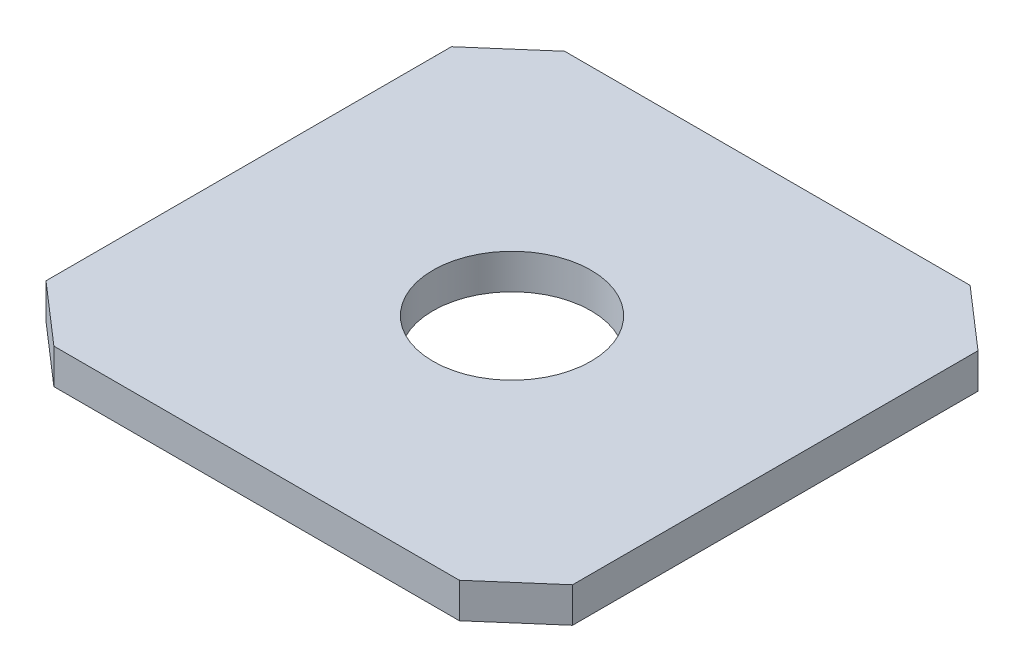
ISO-10303-21;
HEADER;
FILE_DESCRIPTION(('STEP AP214'),'2;1');
FILE_NAME('part.step','',(''),(''),'','','');
FILE_SCHEMA(('AUTOMOTIVE_DESIGN { 1 0 10303 214 1 1 1 1 }'));
ENDSEC;
DATA;
#1=APPLICATION_CONTEXT('core data for automotive mechanical design processes');
#2=APPLICATION_PROTOCOL_DEFINITION('international standard','automotive_design',2000,#1);
#3=PRODUCT_CONTEXT('',#1,'mechanical');
#4=PRODUCT('Part','Part','',(#3));
#5=PRODUCT_RELATED_PRODUCT_CATEGORY('part','',(#4));
#6=PRODUCT_DEFINITION_FORMATION('','',#4);
#7=PRODUCT_DEFINITION_CONTEXT('part definition',#1,'design');
#8=PRODUCT_DEFINITION('design','',#6,#7);
#9=PRODUCT_DEFINITION_SHAPE('','',#8);
#10=(LENGTH_UNIT() NAMED_UNIT(*) SI_UNIT(.MILLI.,.METRE.));
#11=(NAMED_UNIT(*) PLANE_ANGLE_UNIT() SI_UNIT($,.RADIAN.));
#12=(NAMED_UNIT(*) SI_UNIT($,.STERADIAN.) SOLID_ANGLE_UNIT());
#13=UNCERTAINTY_MEASURE_WITH_UNIT(LENGTH_MEASURE(1.E-05),#10,'distance_accuracy_value','');
#14=(GEOMETRIC_REPRESENTATION_CONTEXT(3) GLOBAL_UNCERTAINTY_ASSIGNED_CONTEXT((#13)) GLOBAL_UNIT_ASSIGNED_CONTEXT((#10,
#11,#12)) REPRESENTATION_CONTEXT('',''));
#15=CARTESIAN_POINT('',(0.,0.,0.));
#16=DIRECTION('',(0.,0.,1.));
#17=DIRECTION('',(1.,0.,0.));
#18=AXIS2_PLACEMENT_3D('',#15,#16,#17);
#19=CARTESIAN_POINT('',(-6.6972861855531,2.,-22.7975658796558));
#20=DIRECTION('',(0.656178714924794,0.,0.754605522163498));
#21=DIRECTION('',(0.754605522163498,0.,-0.656178714924794));
#22=AXIS2_PLACEMENT_3D('',#19,#20,#21);
#23=PLANE('',#22);
#24=DIRECTION('',(-0.754605522163498,0.,0.656178714924794));
#25=VECTOR('',#24,1.);
#26=CARTESIAN_POINT('',(-6.6972861855531,0.,-22.7975658796558));
#27=LINE('',#26,#25);
#28=CARTESIAN_POINT('',(-6.6972861855531,0.,-22.7975658796558));
#29=VERTEX_POINT('',#28);
#30=CARTESIAN_POINT('',(-10.1472861855532,0.,-19.7975658796556));
#31=VERTEX_POINT('',#30);
#32=EDGE_CURVE('E139',#29,#31,#27,.T.);
#33=ORIENTED_EDGE('',*,*,#32,.T.);
#34=DIRECTION('',(0.,-1.,0.));
#35=VECTOR('',#34,1.);
#36=CARTESIAN_POINT('',(-10.1472861855532,2.,-19.7975658796556));
#37=LINE('',#36,#35);
#38=CARTESIAN_POINT('',(-10.1472861855532,2.,-19.7975658796556));
#39=VERTEX_POINT('',#38);
#40=EDGE_CURVE('E11',#39,#31,#37,.T.);
#41=ORIENTED_EDGE('',*,*,#40,.F.);
#42=DIRECTION('',(-0.754605522163498,0.,0.656178714924794));
#43=VECTOR('',#42,1.);
#44=CARTESIAN_POINT('',(-6.6972861855531,2.,-22.7975658796558));
#45=LINE('',#44,#43);
#46=CARTESIAN_POINT('',(-6.6972861855531,2.,-22.7975658796558));
#47=VERTEX_POINT('',#46);
#48=EDGE_CURVE('E154',#47,#39,#45,.T.);
#49=ORIENTED_EDGE('',*,*,#48,.F.);
#50=DIRECTION('',(0.,-1.,0.));
#51=VECTOR('',#50,1.);
#52=CARTESIAN_POINT('',(-6.6972861855531,2.,-22.7975658796558));
#53=LINE('',#52,#51);
#54=EDGE_CURVE('E135',#47,#29,#53,.T.);
#55=ORIENTED_EDGE('',*,*,#54,.T.);
#56=EDGE_LOOP('',(#33,#41,#49,#55));
#57=FACE_BOUND('',#56,.T.);
#58=ADVANCED_FACE('F43',(#57),#23,.F.);
#59=CARTESIAN_POINT('',(-10.1472861855532,2.,-19.7975658796556));
#60=DIRECTION('',(1.,0.,0.));
#61=DIRECTION('',(0.,0.,-1.));
#62=AXIS2_PLACEMENT_3D('',#59,#60,#61);
#63=PLANE('',#62);
#64=DIRECTION('',(0.,0.,1.));
#65=VECTOR('',#64,1.);
#66=CARTESIAN_POINT('',(-10.1472861855532,0.,-19.7975658796556));
#67=LINE('',#66,#65);
#68=CARTESIAN_POINT('',(-10.1472861855532,0.,3.30243412034426));
#69=VERTEX_POINT('',#68);
#70=EDGE_CURVE('E142',#31,#69,#67,.T.);
#71=ORIENTED_EDGE('',*,*,#70,.T.);
#72=DIRECTION('',(0.,-1.,0.));
#73=VECTOR('',#72,1.);
#74=CARTESIAN_POINT('',(-10.1472861855532,2.,3.30243412034426));
#75=LINE('',#74,#73);
#76=CARTESIAN_POINT('',(-10.1472861855532,2.,3.30243412034426));
#77=VERTEX_POINT('',#76);
#78=EDGE_CURVE('E51',#77,#69,#75,.T.);
#79=ORIENTED_EDGE('',*,*,#78,.F.);
#80=DIRECTION('',(0.,0.,1.));
#81=VECTOR('',#80,1.);
#82=CARTESIAN_POINT('',(-10.1472861855532,2.,-19.7975658796556));
#83=LINE('',#82,#81);
#84=EDGE_CURVE('E102',#39,#77,#83,.T.);
#85=ORIENTED_EDGE('',*,*,#84,.F.);
#86=ORIENTED_EDGE('',*,*,#40,.T.);
#87=EDGE_LOOP('',(#71,#79,#85,#86));
#88=FACE_BOUND('',#87,.T.);
#89=ADVANCED_FACE('F210',(#88),#63,.F.);
#90=CARTESIAN_POINT('',(-10.1472861855532,2.,3.30243412034426));
#91=DIRECTION('',(0.656178714924794,0.,-0.754605522163498));
#92=DIRECTION('',(-0.754605522163498,0.,-0.656178714924794));
#93=AXIS2_PLACEMENT_3D('',#90,#91,#92);
#94=PLANE('',#93);
#95=DIRECTION('',(0.754605522163498,0.,0.656178714924794));
#96=VECTOR('',#95,1.);
#97=CARTESIAN_POINT('',(-10.1472861855532,0.,3.30243412034426));
#98=LINE('',#97,#96);
#99=CARTESIAN_POINT('',(-6.6972861855531,0.,6.30243412034437));
#100=VERTEX_POINT('',#99);
#101=EDGE_CURVE('E145',#69,#100,#98,.T.);
#102=ORIENTED_EDGE('',*,*,#101,.T.);
#103=DIRECTION('',(0.,-1.,0.));
#104=VECTOR('',#103,1.);
#105=CARTESIAN_POINT('',(-6.6972861855531,2.,6.30243412034437));
#106=LINE('',#105,#104);
#107=CARTESIAN_POINT('',(-6.6972861855531,2.,6.30243412034437));
#108=VERTEX_POINT('',#107);
#109=EDGE_CURVE('E161',#108,#100,#106,.T.);
#110=ORIENTED_EDGE('',*,*,#109,.F.);
#111=DIRECTION('',(0.754605522163498,0.,0.656178714924794));
#112=VECTOR('',#111,1.);
#113=CARTESIAN_POINT('',(-10.1472861855532,2.,3.30243412034426));
#114=LINE('',#113,#112);
#115=EDGE_CURVE('E169',#77,#108,#114,.T.);
#116=ORIENTED_EDGE('',*,*,#115,.F.);
#117=ORIENTED_EDGE('',*,*,#78,.T.);
#118=EDGE_LOOP('',(#102,#110,#116,#117));
#119=FACE_BOUND('',#118,.T.);
#120=ADVANCED_FACE('F167',(#119),#94,.F.);
#121=CARTESIAN_POINT('',(-6.6972861855531,2.,6.30243412034437));
#122=DIRECTION('',(0.,0.,-1.));
#123=DIRECTION('',(-1.,0.,0.));
#124=AXIS2_PLACEMENT_3D('',#121,#122,#123);
#125=PLANE('',#124);
#126=DIRECTION('',(1.,0.,0.));
#127=VECTOR('',#126,1.);
#128=CARTESIAN_POINT('',(-6.6972861855531,0.,6.30243412034437));
#129=LINE('',#128,#127);
#130=CARTESIAN_POINT('',(16.4027138144468,0.,6.30243412034437));
#131=VERTEX_POINT('',#130);
#132=EDGE_CURVE('E147',#100,#131,#129,.T.);
#133=ORIENTED_EDGE('',*,*,#132,.T.);
#134=DIRECTION('',(0.,-1.,0.));
#135=VECTOR('',#134,1.);
#136=CARTESIAN_POINT('',(16.4027138144468,2.,6.30243412034437));
#137=LINE('',#136,#135);
#138=CARTESIAN_POINT('',(16.4027138144468,2.,6.30243412034437));
#139=VERTEX_POINT('',#138);
#140=EDGE_CURVE('E158',#139,#131,#137,.T.);
#141=ORIENTED_EDGE('',*,*,#140,.F.);
#142=DIRECTION('',(1.,0.,0.));
#143=VECTOR('',#142,1.);
#144=CARTESIAN_POINT('',(-6.6972861855531,2.,6.30243412034437));
#145=LINE('',#144,#143);
#146=EDGE_CURVE('E181',#108,#139,#145,.T.);
#147=ORIENTED_EDGE('',*,*,#146,.F.);
#148=ORIENTED_EDGE('',*,*,#109,.T.);
#149=EDGE_LOOP('',(#133,#141,#147,#148));
#150=FACE_BOUND('',#149,.T.);
#151=ADVANCED_FACE('F177',(#150),#125,.F.);
#152=CARTESIAN_POINT('',(16.4027138144468,2.,6.30243412034437));
#153=DIRECTION('',(-0.656178714924794,0.,-0.754605522163498));
#154=DIRECTION('',(-0.754605522163498,0.,0.656178714924794));
#155=AXIS2_PLACEMENT_3D('',#152,#153,#154);
#156=PLANE('',#155);
#157=DIRECTION('',(0.754605522163498,0.,-0.656178714924794));
#158=VECTOR('',#157,1.);
#159=CARTESIAN_POINT('',(16.4027138144468,0.,6.30243412034437));
#160=LINE('',#159,#158);
#161=CARTESIAN_POINT('',(19.8527138144469,0.,3.30243412034426));
#162=VERTEX_POINT('',#161);
#163=EDGE_CURVE('E149',#131,#162,#160,.T.);
#164=ORIENTED_EDGE('',*,*,#163,.T.);
#165=DIRECTION('',(0.,-1.,0.));
#166=VECTOR('',#165,1.);
#167=CARTESIAN_POINT('',(19.8527138144469,2.,3.30243412034426));
#168=LINE('',#167,#166);
#169=CARTESIAN_POINT('',(19.8527138144469,2.,3.30243412034426));
#170=VERTEX_POINT('',#169);
#171=EDGE_CURVE('E130',#170,#162,#168,.T.);
#172=ORIENTED_EDGE('',*,*,#171,.F.);
#173=DIRECTION('',(0.754605522163498,0.,-0.656178714924794));
#174=VECTOR('',#173,1.);
#175=CARTESIAN_POINT('',(16.4027138144468,2.,6.30243412034437));
#176=LINE('',#175,#174);
#177=EDGE_CURVE('E121',#139,#170,#176,.T.);
#178=ORIENTED_EDGE('',*,*,#177,.F.);
#179=ORIENTED_EDGE('',*,*,#140,.T.);
#180=EDGE_LOOP('',(#164,#172,#178,#179));
#181=FACE_BOUND('',#180,.T.);
#182=ADVANCED_FACE('F180',(#181),#156,.F.);
#183=CARTESIAN_POINT('',(19.8527138144469,2.,3.30243412034426));
#184=DIRECTION('',(-1.,0.,0.));
#185=DIRECTION('',(0.,0.,1.));
#186=AXIS2_PLACEMENT_3D('',#183,#184,#185);
#187=PLANE('',#186);
#188=DIRECTION('',(0.,0.,-1.));
#189=VECTOR('',#188,1.);
#190=CARTESIAN_POINT('',(19.8527138144469,0.,3.30243412034426));
#191=LINE('',#190,#189);
#192=CARTESIAN_POINT('',(19.8527138144469,0.,-19.7975658796556));
#193=VERTEX_POINT('',#192);
#194=EDGE_CURVE('E129',#162,#193,#191,.T.);
#195=ORIENTED_EDGE('',*,*,#194,.T.);
#196=DIRECTION('',(0.,-1.,0.));
#197=VECTOR('',#196,1.);
#198=CARTESIAN_POINT('',(19.8527138144469,2.,-19.7975658796556));
#199=LINE('',#198,#197);
#200=CARTESIAN_POINT('',(19.8527138144469,2.,-19.7975658796556));
#201=VERTEX_POINT('',#200);
#202=EDGE_CURVE('E126',#201,#193,#199,.T.);
#203=ORIENTED_EDGE('',*,*,#202,.F.);
#204=DIRECTION('',(0.,0.,-1.));
#205=VECTOR('',#204,1.);
#206=CARTESIAN_POINT('',(19.8527138144469,2.,3.30243412034426));
#207=LINE('',#206,#205);
#208=EDGE_CURVE('E115',#170,#201,#207,.T.);
#209=ORIENTED_EDGE('',*,*,#208,.F.);
#210=ORIENTED_EDGE('',*,*,#171,.T.);
#211=EDGE_LOOP('',(#195,#203,#209,#210));
#212=FACE_BOUND('',#211,.T.);
#213=ADVANCED_FACE('F127',(#212),#187,.F.);
#214=CARTESIAN_POINT('',(19.8527138144469,2.,-19.7975658796556));
#215=DIRECTION('',(-0.656178714924794,0.,0.754605522163498));
#216=DIRECTION('',(0.754605522163498,0.,0.656178714924794));
#217=AXIS2_PLACEMENT_3D('',#214,#215,#216);
#218=PLANE('',#217);
#219=DIRECTION('',(-0.754605522163498,0.,-0.656178714924794));
#220=VECTOR('',#219,1.);
#221=CARTESIAN_POINT('',(19.8527138144469,0.,-19.7975658796556));
#222=LINE('',#221,#220);
#223=CARTESIAN_POINT('',(16.4027138144468,0.,-22.7975658796558));
#224=VERTEX_POINT('',#223);
#225=EDGE_CURVE('E88',#193,#224,#222,.T.);
#226=ORIENTED_EDGE('',*,*,#225,.T.);
#227=DIRECTION('',(0.,-1.,0.));
#228=VECTOR('',#227,1.);
#229=CARTESIAN_POINT('',(16.4027138144468,2.,-22.7975658796558));
#230=LINE('',#229,#228);
#231=CARTESIAN_POINT('',(16.4027138144468,2.,-22.7975658796558));
#232=VERTEX_POINT('',#231);
#233=EDGE_CURVE('E131',#232,#224,#230,.T.);
#234=ORIENTED_EDGE('',*,*,#233,.F.);
#235=DIRECTION('',(-0.754605522163498,0.,-0.656178714924794));
#236=VECTOR('',#235,1.);
#237=CARTESIAN_POINT('',(19.8527138144469,2.,-19.7975658796556));
#238=LINE('',#237,#236);
#239=EDGE_CURVE('E119',#201,#232,#238,.T.);
#240=ORIENTED_EDGE('',*,*,#239,.F.);
#241=ORIENTED_EDGE('',*,*,#202,.T.);
#242=EDGE_LOOP('',(#226,#234,#240,#241));
#243=FACE_BOUND('',#242,.T.);
#244=ADVANCED_FACE('F133',(#243),#218,.F.);
#245=CARTESIAN_POINT('',(16.4027138144468,2.,-22.7975658796558));
#246=DIRECTION('',(0.,0.,1.));
#247=DIRECTION('',(1.,0.,0.));
#248=AXIS2_PLACEMENT_3D('',#245,#246,#247);
#249=PLANE('',#248);
#250=DIRECTION('',(-1.,0.,0.));
#251=VECTOR('',#250,1.);
#252=CARTESIAN_POINT('',(16.4027138144468,0.,-22.7975658796558));
#253=LINE('',#252,#251);
#254=EDGE_CURVE('E94',#224,#29,#253,.T.);
#255=ORIENTED_EDGE('',*,*,#254,.T.);
#256=ORIENTED_EDGE('',*,*,#54,.F.);
#257=DIRECTION('',(-1.,0.,0.));
#258=VECTOR('',#257,1.);
#259=CARTESIAN_POINT('',(16.4027138144468,2.,-22.7975658796558));
#260=LINE('',#259,#258);
#261=EDGE_CURVE('E59',#232,#47,#260,.T.);
#262=ORIENTED_EDGE('',*,*,#261,.F.);
#263=ORIENTED_EDGE('',*,*,#233,.T.);
#264=EDGE_LOOP('',(#255,#256,#262,#263));
#265=FACE_BOUND('',#264,.T.);
#266=ADVANCED_FACE('F201',(#265),#249,.F.);
#267=CARTESIAN_POINT('',(0.,2.,0.));
#268=DIRECTION('',(0.,1.,0.));
#269=DIRECTION('',(0.,0.,1.));
#270=AXIS2_PLACEMENT_3D('',#267,#268,#269);
#271=PLANE('',#270);
#272=CARTESIAN_POINT('',(4.85271381444685,2.,-8.24756587965569));
#273=DIRECTION('',(0.,1.,0.));
#274=DIRECTION('',(0.,0.,1.));
#275=AXIS2_PLACEMENT_3D('',#272,#273,#274);
#276=CIRCLE('',#275,4.5);
#277=CARTESIAN_POINT('',(4.85271381444685,2.,-3.74756587965569));
#278=VERTEX_POINT('',#277);
#279=EDGE_CURVE('E187',#278,#278,#276,.T.);
#280=ORIENTED_EDGE('',*,*,#279,.F.);
#281=EDGE_LOOP('',(#280));
#282=FACE_BOUND('',#281,.T.);
#283=ORIENTED_EDGE('',*,*,#48,.T.);
#284=ORIENTED_EDGE('',*,*,#84,.T.);
#285=ORIENTED_EDGE('',*,*,#115,.T.);
#286=ORIENTED_EDGE('',*,*,#146,.T.);
#287=ORIENTED_EDGE('',*,*,#177,.T.);
#288=ORIENTED_EDGE('',*,*,#208,.T.);
#289=ORIENTED_EDGE('',*,*,#239,.T.);
#290=ORIENTED_EDGE('',*,*,#261,.T.);
#291=EDGE_LOOP('',(#283,#284,#285,#286,#287,#288,#289,#290));
#292=FACE_BOUND('',#291,.T.);
#293=ADVANCED_FACE('F117',(#282,#292),#271,.T.);
#294=CARTESIAN_POINT('',(0.,0.,0.));
#295=DIRECTION('',(0.,1.,0.));
#296=DIRECTION('',(0.,0.,1.));
#297=AXIS2_PLACEMENT_3D('',#294,#295,#296);
#298=PLANE('',#297);
#299=CARTESIAN_POINT('',(4.85271381444685,0.,-8.24756587965569));
#300=DIRECTION('',(0.,1.,0.));
#301=DIRECTION('',(0.,0.,1.));
#302=AXIS2_PLACEMENT_3D('',#299,#300,#301);
#303=CIRCLE('',#302,4.5);
#304=CARTESIAN_POINT('',(4.85271381444685,0.,-3.74756587965569));
#305=VERTEX_POINT('',#304);
#306=EDGE_CURVE('E143',#305,#305,#303,.T.);
#307=ORIENTED_EDGE('',*,*,#306,.T.);
#308=EDGE_LOOP('',(#307));
#309=FACE_BOUND('',#308,.T.);
#310=ORIENTED_EDGE('',*,*,#32,.F.);
#311=ORIENTED_EDGE('',*,*,#254,.F.);
#312=ORIENTED_EDGE('',*,*,#225,.F.);
#313=ORIENTED_EDGE('',*,*,#194,.F.);
#314=ORIENTED_EDGE('',*,*,#163,.F.);
#315=ORIENTED_EDGE('',*,*,#132,.F.);
#316=ORIENTED_EDGE('',*,*,#101,.F.);
#317=ORIENTED_EDGE('',*,*,#70,.F.);
#318=EDGE_LOOP('',(#310,#311,#312,#313,#314,#315,#316,#317));
#319=FACE_BOUND('',#318,.T.);
#320=ADVANCED_FACE('F173',(#309,#319),#298,.F.);
#321=CARTESIAN_POINT('',(4.85271381444685,0.,-8.24756587965569));
#322=DIRECTION('',(0.,1.,0.));
#323=DIRECTION('',(0.,0.,1.));
#324=AXIS2_PLACEMENT_3D('',#321,#322,#323);
#325=CYLINDRICAL_SURFACE('',#324,4.5);
#326=ORIENTED_EDGE('',*,*,#306,.F.);
#327=EDGE_LOOP('',(#326));
#328=FACE_BOUND('',#327,.T.);
#329=ORIENTED_EDGE('',*,*,#279,.T.);
#330=EDGE_LOOP('',(#329));
#331=FACE_BOUND('',#330,.T.);
#332=ADVANCED_FACE('F194',(#328,#331),#325,.F.);
#333=CLOSED_SHELL('',(#58,#89,#120,#151,#182,#213,#244,#266,#293,#320,#332));
#334=MANIFOLD_SOLID_BREP('B2',#333);
#335=ADVANCED_BREP_SHAPE_REPRESENTATION('',(#18,#334),#14);
#336=SHAPE_DEFINITION_REPRESENTATION(#9,#335);
ENDSEC;
END-ISO-10303-21;
